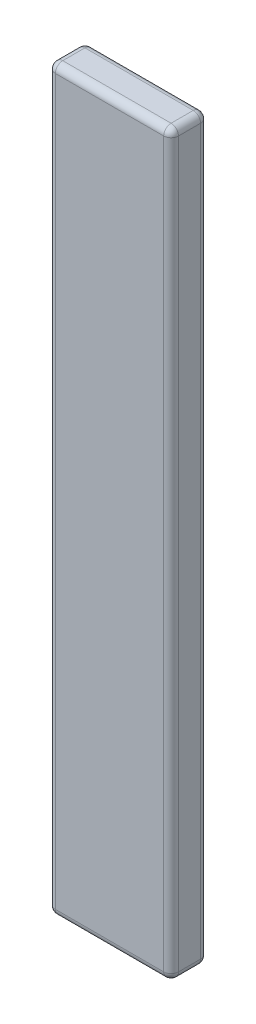
ISO-10303-21;
HEADER;
FILE_DESCRIPTION(('STEP AP214'),'2;1');
FILE_NAME('part.step','',(''),(''),'','','');
FILE_SCHEMA(('AUTOMOTIVE_DESIGN { 1 0 10303 214 1 1 1 1 }'));
ENDSEC;
DATA;
#1=APPLICATION_CONTEXT('core data for automotive mechanical design processes');
#2=APPLICATION_PROTOCOL_DEFINITION('international standard','automotive_design',2000,#1);
#3=PRODUCT_CONTEXT('',#1,'mechanical');
#4=PRODUCT('Part','Part','',(#3));
#5=PRODUCT_RELATED_PRODUCT_CATEGORY('part','',(#4));
#6=PRODUCT_DEFINITION_FORMATION('','',#4);
#7=PRODUCT_DEFINITION_CONTEXT('part definition',#1,'design');
#8=PRODUCT_DEFINITION('design','',#6,#7);
#9=PRODUCT_DEFINITION_SHAPE('','',#8);
#10=(LENGTH_UNIT() NAMED_UNIT(*) SI_UNIT(.MILLI.,.METRE.));
#11=(NAMED_UNIT(*) PLANE_ANGLE_UNIT() SI_UNIT($,.RADIAN.));
#12=(NAMED_UNIT(*) SI_UNIT($,.STERADIAN.) SOLID_ANGLE_UNIT());
#13=UNCERTAINTY_MEASURE_WITH_UNIT(LENGTH_MEASURE(1.E-05),#10,'distance_accuracy_value','');
#14=(GEOMETRIC_REPRESENTATION_CONTEXT(3) GLOBAL_UNCERTAINTY_ASSIGNED_CONTEXT((#13)) GLOBAL_UNIT_ASSIGNED_CONTEXT((#10,
#11,#12)) REPRESENTATION_CONTEXT('',''));
#15=CARTESIAN_POINT('',(0.,0.,0.));
#16=DIRECTION('',(0.,0.,1.));
#17=DIRECTION('',(1.,0.,0.));
#18=AXIS2_PLACEMENT_3D('',#15,#16,#17);
#19=CARTESIAN_POINT('',(0.,0.,3.));
#20=DIRECTION('',(1.,0.,0.));
#21=DIRECTION('',(0.,0.,-1.));
#22=AXIS2_PLACEMENT_3D('',#19,#20,#21);
#23=PLANE('',#22);
#24=DIRECTION('',(0.,-1.,0.));
#25=VECTOR('',#24,1.);
#26=CARTESIAN_POINT('',(0.,0.,0.6));
#27=LINE('',#26,#25);
#28=CARTESIAN_POINT('',(0.,-0.6,0.6));
#29=VERTEX_POINT('',#28);
#30=CARTESIAN_POINT('',(0.,-59.4,0.6));
#31=VERTEX_POINT('',#30);
#32=EDGE_CURVE('E174',#29,#31,#27,.T.);
#33=ORIENTED_EDGE('',*,*,#32,.T.);
#34=DIRECTION('',(0.,0.,-1.));
#35=VECTOR('',#34,1.);
#36=CARTESIAN_POINT('',(0.,-59.4,3.));
#37=LINE('',#36,#35);
#38=CARTESIAN_POINT('',(0.,-59.4,2.4));
#39=VERTEX_POINT('',#38);
#40=EDGE_CURVE('E176',#31,#39,#37,.F.);
#41=ORIENTED_EDGE('',*,*,#40,.T.);
#42=DIRECTION('',(0.,-1.,0.));
#43=VECTOR('',#42,1.);
#44=CARTESIAN_POINT('',(0.,0.,2.4));
#45=LINE('',#44,#43);
#46=CARTESIAN_POINT('',(0.,-0.6,2.4));
#47=VERTEX_POINT('',#46);
#48=EDGE_CURVE('E170',#39,#47,#45,.F.);
#49=ORIENTED_EDGE('',*,*,#48,.T.);
#50=DIRECTION('',(0.,0.,-1.));
#51=VECTOR('',#50,1.);
#52=CARTESIAN_POINT('',(0.,-0.6,3.));
#53=LINE('',#52,#51);
#54=EDGE_CURVE('E172',#47,#29,#53,.T.);
#55=ORIENTED_EDGE('',*,*,#54,.T.);
#56=EDGE_LOOP('',(#33,#41,#49,#55));
#57=FACE_BOUND('',#56,.T.);
#58=ADVANCED_FACE('F39',(#57),#23,.F.);
#59=CARTESIAN_POINT('',(0.,-60.,3.));
#60=DIRECTION('',(0.,1.,0.));
#61=DIRECTION('',(0.,0.,1.));
#62=AXIS2_PLACEMENT_3D('',#59,#60,#61);
#63=PLANE('',#62);
#64=DIRECTION('',(1.,0.,0.));
#65=VECTOR('',#64,1.);
#66=CARTESIAN_POINT('',(0.,-60.,2.4));
#67=LINE('',#66,#65);
#68=CARTESIAN_POINT('',(9.40000000000001,-60.,2.4));
#69=VERTEX_POINT('',#68);
#70=CARTESIAN_POINT('',(0.6,-60.,2.4));
#71=VERTEX_POINT('',#70);
#72=EDGE_CURVE('E132',#69,#71,#67,.F.);
#73=ORIENTED_EDGE('',*,*,#72,.T.);
#74=DIRECTION('',(0.,0.,-1.));
#75=VECTOR('',#74,1.);
#76=CARTESIAN_POINT('',(0.6,-60.,3.));
#77=LINE('',#76,#75);
#78=CARTESIAN_POINT('',(0.6,-60.,0.6));
#79=VERTEX_POINT('',#78);
#80=EDGE_CURVE('E168',#71,#79,#77,.T.);
#81=ORIENTED_EDGE('',*,*,#80,.T.);
#82=DIRECTION('',(1.,0.,0.));
#83=VECTOR('',#82,1.);
#84=CARTESIAN_POINT('',(0.,-60.,0.6));
#85=LINE('',#84,#83);
#86=CARTESIAN_POINT('',(9.40000000000001,-60.,0.6));
#87=VERTEX_POINT('',#86);
#88=EDGE_CURVE('E135',#79,#87,#85,.T.);
#89=ORIENTED_EDGE('',*,*,#88,.T.);
#90=DIRECTION('',(0.,0.,-1.));
#91=VECTOR('',#90,1.);
#92=CARTESIAN_POINT('',(9.40000000000001,-60.,3.));
#93=LINE('',#92,#91);
#94=EDGE_CURVE('E127',#87,#69,#93,.F.);
#95=ORIENTED_EDGE('',*,*,#94,.T.);
#96=EDGE_LOOP('',(#73,#81,#89,#95));
#97=FACE_BOUND('',#96,.T.);
#98=ADVANCED_FACE('F129',(#97),#63,.F.);
#99=CARTESIAN_POINT('',(10.,0.,3.));
#100=DIRECTION('',(-1.,0.,0.));
#101=DIRECTION('',(0.,-1.,0.));
#102=AXIS2_PLACEMENT_3D('',#99,#100,#101);
#103=PLANE('',#102);
#104=DIRECTION('',(0.,0.,-1.));
#105=VECTOR('',#104,1.);
#106=CARTESIAN_POINT('',(10.,-59.4,3.));
#107=LINE('',#106,#105);
#108=CARTESIAN_POINT('',(10.,-59.4,2.4));
#109=VERTEX_POINT('',#108);
#110=CARTESIAN_POINT('',(10.,-59.4,0.6));
#111=VERTEX_POINT('',#110);
#112=EDGE_CURVE('E145',#109,#111,#107,.T.);
#113=ORIENTED_EDGE('',*,*,#112,.T.);
#114=DIRECTION('',(0.,1.,0.));
#115=VECTOR('',#114,1.);
#116=CARTESIAN_POINT('',(10.,0.,0.6));
#117=LINE('',#116,#115);
#118=CARTESIAN_POINT('',(10.,-0.6,0.6));
#119=VERTEX_POINT('',#118);
#120=EDGE_CURVE('E193',#111,#119,#117,.T.);
#121=ORIENTED_EDGE('',*,*,#120,.T.);
#122=DIRECTION('',(0.,0.,-1.));
#123=VECTOR('',#122,1.);
#124=CARTESIAN_POINT('',(10.,-0.6,3.));
#125=LINE('',#124,#123);
#126=CARTESIAN_POINT('',(10.,-0.6,2.4));
#127=VERTEX_POINT('',#126);
#128=EDGE_CURVE('E190',#119,#127,#125,.F.);
#129=ORIENTED_EDGE('',*,*,#128,.T.);
#130=DIRECTION('',(0.,1.,0.));
#131=VECTOR('',#130,1.);
#132=CARTESIAN_POINT('',(10.,-60.,2.4));
#133=LINE('',#132,#131);
#134=EDGE_CURVE('E188',#127,#109,#133,.F.);
#135=ORIENTED_EDGE('',*,*,#134,.T.);
#136=EDGE_LOOP('',(#113,#121,#129,#135));
#137=FACE_BOUND('',#136,.T.);
#138=ADVANCED_FACE('F270',(#137),#103,.F.);
#139=CARTESIAN_POINT('',(0.,0.,3.));
#140=DIRECTION('',(0.,-1.,0.));
#141=DIRECTION('',(0.,0.,-1.));
#142=AXIS2_PLACEMENT_3D('',#139,#140,#141);
#143=PLANE('',#142);
#144=DIRECTION('',(-1.,0.,0.));
#145=VECTOR('',#144,1.);
#146=CARTESIAN_POINT('',(0.,0.,0.6));
#147=LINE('',#146,#145);
#148=CARTESIAN_POINT('',(9.4,0.,0.6));
#149=VERTEX_POINT('',#148);
#150=CARTESIAN_POINT('',(0.6,0.,0.6));
#151=VERTEX_POINT('',#150);
#152=EDGE_CURVE('E200',#149,#151,#147,.T.);
#153=ORIENTED_EDGE('',*,*,#152,.T.);
#154=DIRECTION('',(0.,0.,-1.));
#155=VECTOR('',#154,1.);
#156=CARTESIAN_POINT('',(0.6,0.,3.));
#157=LINE('',#156,#155);
#158=CARTESIAN_POINT('',(0.6,0.,2.4));
#159=VERTEX_POINT('',#158);
#160=EDGE_CURVE('E202',#151,#159,#157,.F.);
#161=ORIENTED_EDGE('',*,*,#160,.T.);
#162=DIRECTION('',(-1.,0.,0.));
#163=VECTOR('',#162,1.);
#164=CARTESIAN_POINT('',(10.,0.,2.4));
#165=LINE('',#164,#163);
#166=CARTESIAN_POINT('',(9.4,0.,2.4));
#167=VERTEX_POINT('',#166);
#168=EDGE_CURVE('E196',#159,#167,#165,.F.);
#169=ORIENTED_EDGE('',*,*,#168,.T.);
#170=DIRECTION('',(0.,0.,-1.));
#171=VECTOR('',#170,1.);
#172=CARTESIAN_POINT('',(9.4,0.,3.));
#173=LINE('',#172,#171);
#174=EDGE_CURVE('E198',#167,#149,#173,.T.);
#175=ORIENTED_EDGE('',*,*,#174,.T.);
#176=EDGE_LOOP('',(#153,#161,#169,#175));
#177=FACE_BOUND('',#176,.T.);
#178=ADVANCED_FACE('F299',(#177),#143,.F.);
#179=CARTESIAN_POINT('',(0.,0.,3.));
#180=DIRECTION('',(0.,0.,1.));
#181=DIRECTION('',(1.,0.,0.));
#182=AXIS2_PLACEMENT_3D('',#179,#180,#181);
#183=PLANE('',#182);
#184=DIRECTION('',(-1.,0.,0.));
#185=VECTOR('',#184,1.);
#186=CARTESIAN_POINT('',(0.,-0.6,3.));
#187=LINE('',#186,#185);
#188=CARTESIAN_POINT('',(9.4,-0.6,3.));
#189=VERTEX_POINT('',#188);
#190=CARTESIAN_POINT('',(0.6,-0.6,3.));
#191=VERTEX_POINT('',#190);
#192=EDGE_CURVE('E59',#189,#191,#187,.T.);
#193=ORIENTED_EDGE('',*,*,#192,.T.);
#194=DIRECTION('',(0.,-1.,0.));
#195=VECTOR('',#194,1.);
#196=CARTESIAN_POINT('',(0.6,-60.,3.));
#197=LINE('',#196,#195);
#198=CARTESIAN_POINT('',(0.6,-59.4,3.));
#199=VERTEX_POINT('',#198);
#200=EDGE_CURVE('E11',#191,#199,#197,.T.);
#201=ORIENTED_EDGE('',*,*,#200,.T.);
#202=DIRECTION('',(1.,0.,0.));
#203=VECTOR('',#202,1.);
#204=CARTESIAN_POINT('',(10.,-59.4,3.));
#205=LINE('',#204,#203);
#206=CARTESIAN_POINT('',(9.40000000000001,-59.4,3.));
#207=VERTEX_POINT('',#206);
#208=EDGE_CURVE('E48',#199,#207,#205,.T.);
#209=ORIENTED_EDGE('',*,*,#208,.T.);
#210=DIRECTION('',(0.,1.,0.));
#211=VECTOR('',#210,1.);
#212=CARTESIAN_POINT('',(9.4,0.,3.));
#213=LINE('',#212,#211);
#214=EDGE_CURVE('E205',#207,#189,#213,.T.);
#215=ORIENTED_EDGE('',*,*,#214,.T.);
#216=EDGE_LOOP('',(#193,#201,#209,#215));
#217=FACE_BOUND('',#216,.T.);
#218=ADVANCED_FACE('F315',(#217),#183,.T.);
#219=CARTESIAN_POINT('',(0.,0.,0.));
#220=DIRECTION('',(0.,0.,1.));
#221=DIRECTION('',(1.,0.,0.));
#222=AXIS2_PLACEMENT_3D('',#219,#220,#221);
#223=PLANE('',#222);
#224=DIRECTION('',(1.,0.,0.));
#225=VECTOR('',#224,1.);
#226=CARTESIAN_POINT('',(0.,-59.4,0.));
#227=LINE('',#226,#225);
#228=CARTESIAN_POINT('',(9.40000000000001,-59.4,0.));
#229=VERTEX_POINT('',#228);
#230=CARTESIAN_POINT('',(0.6,-59.4,0.));
#231=VERTEX_POINT('',#230);
#232=EDGE_CURVE('E183',#229,#231,#227,.F.);
#233=ORIENTED_EDGE('',*,*,#232,.T.);
#234=DIRECTION('',(0.,-1.,0.));
#235=VECTOR('',#234,1.);
#236=CARTESIAN_POINT('',(0.6,0.,0.));
#237=LINE('',#236,#235);
#238=CARTESIAN_POINT('',(0.6,-0.6,0.));
#239=VERTEX_POINT('',#238);
#240=EDGE_CURVE('E185',#231,#239,#237,.F.);
#241=ORIENTED_EDGE('',*,*,#240,.T.);
#242=DIRECTION('',(-1.,0.,0.));
#243=VECTOR('',#242,1.);
#244=CARTESIAN_POINT('',(0.,-0.6,0.));
#245=LINE('',#244,#243);
#246=CARTESIAN_POINT('',(9.4,-0.6,0.));
#247=VERTEX_POINT('',#246);
#248=EDGE_CURVE('E179',#239,#247,#245,.F.);
#249=ORIENTED_EDGE('',*,*,#248,.T.);
#250=DIRECTION('',(0.,1.,0.));
#251=VECTOR('',#250,1.);
#252=CARTESIAN_POINT('',(9.4,0.,0.));
#253=LINE('',#252,#251);
#254=EDGE_CURVE('E181',#247,#229,#253,.F.);
#255=ORIENTED_EDGE('',*,*,#254,.T.);
#256=EDGE_LOOP('',(#233,#241,#249,#255));
#257=FACE_BOUND('',#256,.T.);
#258=ADVANCED_FACE('F283',(#257),#223,.F.);
#259=CARTESIAN_POINT('',(9.4,-0.6,3.));
#260=DIRECTION('',(0.,0.,-1.));
#261=DIRECTION('',(-1.,0.,0.));
#262=AXIS2_PLACEMENT_3D('',#259,#260,#261);
#263=CYLINDRICAL_SURFACE('',#262,0.6);
#264=CARTESIAN_POINT('',(9.4,-0.6,2.4));
#265=DIRECTION('',(0.,0.,1.));
#266=DIRECTION('',(1.,0.,0.));
#267=AXIS2_PLACEMENT_3D('',#264,#265,#266);
#268=CIRCLE('',#267,0.6);
#269=EDGE_CURVE('E43',#127,#167,#268,.T.);
#270=ORIENTED_EDGE('',*,*,#269,.F.);
#271=ORIENTED_EDGE('',*,*,#128,.F.);
#272=CARTESIAN_POINT('',(9.4,-0.6,0.6));
#273=DIRECTION('',(0.,0.,-1.));
#274=DIRECTION('',(-1.,0.,0.));
#275=AXIS2_PLACEMENT_3D('',#272,#273,#274);
#276=CIRCLE('',#275,0.6);
#277=EDGE_CURVE('E165',#149,#119,#276,.T.);
#278=ORIENTED_EDGE('',*,*,#277,.F.);
#279=ORIENTED_EDGE('',*,*,#174,.F.);
#280=EDGE_LOOP('',(#270,#271,#278,#279));
#281=FACE_BOUND('',#280,.T.);
#282=ADVANCED_FACE('F41',(#281),#263,.T.);
#283=CARTESIAN_POINT('',(9.4,-0.6,2.4));
#284=DIRECTION('',(0.,1.,0.));
#285=DIRECTION('',(0.,0.,1.));
#286=AXIS2_PLACEMENT_3D('',#283,#284,#285);
#287=SPHERICAL_SURFACE('',#286,0.6);
#288=CARTESIAN_POINT('',(9.4,-0.6,2.4));
#289=DIRECTION('',(0.,1.,0.));
#290=DIRECTION('',(-1.,0.,0.));
#291=AXIS2_PLACEMENT_3D('',#288,#289,#290);
#292=CIRCLE('',#291,0.6);
#293=EDGE_CURVE('E250',#127,#189,#292,.F.);
#294=ORIENTED_EDGE('',*,*,#293,.F.);
#295=ORIENTED_EDGE('',*,*,#269,.T.);
#296=CARTESIAN_POINT('',(9.4,-0.6,2.4));
#297=DIRECTION('',(1.,0.,0.));
#298=DIRECTION('',(0.,0.,-1.));
#299=AXIS2_PLACEMENT_3D('',#296,#297,#298);
#300=CIRCLE('',#299,0.6);
#301=EDGE_CURVE('E253',#189,#167,#300,.F.);
#302=ORIENTED_EDGE('',*,*,#301,.F.);
#303=EDGE_LOOP('',(#294,#295,#302));
#304=FACE_BOUND('',#303,.T.);
#305=ADVANCED_FACE('F311',(#304),#287,.T.);
#306=CARTESIAN_POINT('',(9.4,-0.6,0.6));
#307=DIRECTION('',(1.,0.,0.));
#308=DIRECTION('',(0.,0.,-1.));
#309=AXIS2_PLACEMENT_3D('',#306,#307,#308);
#310=SPHERICAL_SURFACE('',#309,0.6);
#311=CARTESIAN_POINT('',(9.4,-0.6,0.6));
#312=DIRECTION('',(1.,0.,0.));
#313=DIRECTION('',(0.,0.,-1.));
#314=AXIS2_PLACEMENT_3D('',#311,#312,#313);
#315=CIRCLE('',#314,0.6);
#316=EDGE_CURVE('E245',#149,#247,#315,.F.);
#317=ORIENTED_EDGE('',*,*,#316,.F.);
#318=ORIENTED_EDGE('',*,*,#277,.T.);
#319=CARTESIAN_POINT('',(9.4,-0.6,0.6));
#320=DIRECTION('',(0.,1.,0.));
#321=DIRECTION('',(-1.,0.,0.));
#322=AXIS2_PLACEMENT_3D('',#319,#320,#321);
#323=CIRCLE('',#322,0.6);
#324=EDGE_CURVE('E248',#247,#119,#323,.F.);
#325=ORIENTED_EDGE('',*,*,#324,.F.);
#326=EDGE_LOOP('',(#317,#318,#325));
#327=FACE_BOUND('',#326,.T.);
#328=ADVANCED_FACE('F261',(#327),#310,.T.);
#329=CARTESIAN_POINT('',(0.,-0.6,2.4));
#330=DIRECTION('',(1.,0.,0.));
#331=DIRECTION('',(0.,0.,-1.));
#332=AXIS2_PLACEMENT_3D('',#329,#330,#331);
#333=CYLINDRICAL_SURFACE('',#332,0.6);
#334=ORIENTED_EDGE('',*,*,#301,.T.);
#335=ORIENTED_EDGE('',*,*,#168,.F.);
#336=CARTESIAN_POINT('',(0.6,-0.6,2.4));
#337=DIRECTION('',(-1.,0.,0.));
#338=DIRECTION('',(0.,0.,1.));
#339=AXIS2_PLACEMENT_3D('',#336,#337,#338);
#340=CIRCLE('',#339,0.6);
#341=EDGE_CURVE('E240',#191,#159,#340,.T.);
#342=ORIENTED_EDGE('',*,*,#341,.F.);
#343=ORIENTED_EDGE('',*,*,#192,.F.);
#344=EDGE_LOOP('',(#334,#335,#342,#343));
#345=FACE_BOUND('',#344,.T.);
#346=ADVANCED_FACE('F308',(#345),#333,.T.);
#347=CARTESIAN_POINT('',(9.4,0.,2.4));
#348=DIRECTION('',(0.,-1.,0.));
#349=DIRECTION('',(1.,0.,0.));
#350=AXIS2_PLACEMENT_3D('',#347,#348,#349);
#351=CYLINDRICAL_SURFACE('',#350,0.6);
#352=ORIENTED_EDGE('',*,*,#293,.T.);
#353=ORIENTED_EDGE('',*,*,#214,.F.);
#354=CARTESIAN_POINT('',(9.40000000000001,-59.4,2.4));
#355=DIRECTION('',(0.,-1.,0.));
#356=DIRECTION('',(0.,0.,-1.));
#357=AXIS2_PLACEMENT_3D('',#354,#355,#356);
#358=CIRCLE('',#357,0.6);
#359=EDGE_CURVE('E149',#109,#207,#358,.T.);
#360=ORIENTED_EDGE('',*,*,#359,.F.);
#361=ORIENTED_EDGE('',*,*,#134,.F.);
#362=EDGE_LOOP('',(#352,#353,#360,#361));
#363=FACE_BOUND('',#362,.T.);
#364=ADVANCED_FACE('F314',(#363),#351,.T.);
#365=CARTESIAN_POINT('',(9.40000000000001,-59.4,3.));
#366=DIRECTION('',(0.,0.,-1.));
#367=DIRECTION('',(-1.,0.,0.));
#368=AXIS2_PLACEMENT_3D('',#365,#366,#367);
#369=CYLINDRICAL_SURFACE('',#368,0.6);
#370=CARTESIAN_POINT('',(9.40000000000001,-59.4,0.6));
#371=DIRECTION('',(0.,0.,-1.));
#372=DIRECTION('',(-1.,0.,0.));
#373=AXIS2_PLACEMENT_3D('',#370,#371,#372);
#374=CIRCLE('',#373,0.6);
#375=EDGE_CURVE('E150',#111,#87,#374,.T.);
#376=ORIENTED_EDGE('',*,*,#375,.F.);
#377=ORIENTED_EDGE('',*,*,#112,.F.);
#378=CARTESIAN_POINT('',(9.40000000000001,-59.4,2.4));
#379=DIRECTION('',(0.,0.,1.));
#380=DIRECTION('',(1.,0.,0.));
#381=AXIS2_PLACEMENT_3D('',#378,#379,#380);
#382=CIRCLE('',#381,0.6);
#383=EDGE_CURVE('E142',#69,#109,#382,.T.);
#384=ORIENTED_EDGE('',*,*,#383,.F.);
#385=ORIENTED_EDGE('',*,*,#94,.F.);
#386=EDGE_LOOP('',(#376,#377,#384,#385));
#387=FACE_BOUND('',#386,.T.);
#388=ADVANCED_FACE('F144',(#387),#369,.T.);
#389=CARTESIAN_POINT('',(9.4,0.,0.6));
#390=DIRECTION('',(0.,1.,0.));
#391=DIRECTION('',(-1.,0.,0.));
#392=AXIS2_PLACEMENT_3D('',#389,#390,#391);
#393=CYLINDRICAL_SURFACE('',#392,0.6);
#394=ORIENTED_EDGE('',*,*,#324,.T.);
#395=ORIENTED_EDGE('',*,*,#120,.F.);
#396=CARTESIAN_POINT('',(9.40000000000001,-59.4,0.6));
#397=DIRECTION('',(0.,-1.,0.));
#398=DIRECTION('',(0.,0.,-1.));
#399=AXIS2_PLACEMENT_3D('',#396,#397,#398);
#400=CIRCLE('',#399,0.6);
#401=EDGE_CURVE('E235',#229,#111,#400,.T.);
#402=ORIENTED_EDGE('',*,*,#401,.F.);
#403=ORIENTED_EDGE('',*,*,#254,.F.);
#404=EDGE_LOOP('',(#394,#395,#402,#403));
#405=FACE_BOUND('',#404,.T.);
#406=ADVANCED_FACE('F273',(#405),#393,.T.);
#407=CARTESIAN_POINT('',(0.,-0.6,0.6));
#408=DIRECTION('',(-1.,0.,0.));
#409=DIRECTION('',(0.,0.,1.));
#410=AXIS2_PLACEMENT_3D('',#407,#408,#409);
#411=CYLINDRICAL_SURFACE('',#410,0.6);
#412=ORIENTED_EDGE('',*,*,#316,.T.);
#413=ORIENTED_EDGE('',*,*,#248,.F.);
#414=CARTESIAN_POINT('',(0.6,-0.6,0.6));
#415=DIRECTION('',(-1.,0.,0.));
#416=DIRECTION('',(0.,0.,1.));
#417=AXIS2_PLACEMENT_3D('',#414,#415,#416);
#418=CIRCLE('',#417,0.6);
#419=EDGE_CURVE('E232',#151,#239,#418,.T.);
#420=ORIENTED_EDGE('',*,*,#419,.F.);
#421=ORIENTED_EDGE('',*,*,#152,.F.);
#422=EDGE_LOOP('',(#412,#413,#420,#421));
#423=FACE_BOUND('',#422,.T.);
#424=ADVANCED_FACE('F296',(#423),#411,.T.);
#425=CARTESIAN_POINT('',(0.6,-0.6,3.));
#426=DIRECTION('',(0.,0.,-1.));
#427=DIRECTION('',(-1.,0.,0.));
#428=AXIS2_PLACEMENT_3D('',#425,#426,#427);
#429=CYLINDRICAL_SURFACE('',#428,0.6);
#430=CARTESIAN_POINT('',(0.6,-0.6,2.4));
#431=DIRECTION('',(0.,0.,1.));
#432=DIRECTION('',(1.,0.,0.));
#433=AXIS2_PLACEMENT_3D('',#430,#431,#432);
#434=CIRCLE('',#433,0.6);
#435=EDGE_CURVE('E242',#159,#47,#434,.T.);
#436=ORIENTED_EDGE('',*,*,#435,.F.);
#437=ORIENTED_EDGE('',*,*,#160,.F.);
#438=CARTESIAN_POINT('',(0.6,-0.6,0.6));
#439=DIRECTION('',(0.,0.,-1.));
#440=DIRECTION('',(-1.,0.,0.));
#441=AXIS2_PLACEMENT_3D('',#438,#439,#440);
#442=CIRCLE('',#441,0.6);
#443=EDGE_CURVE('E229',#29,#151,#442,.T.);
#444=ORIENTED_EDGE('',*,*,#443,.F.);
#445=ORIENTED_EDGE('',*,*,#54,.F.);
#446=EDGE_LOOP('',(#436,#437,#444,#445));
#447=FACE_BOUND('',#446,.T.);
#448=ADVANCED_FACE('F302',(#447),#429,.T.);
#449=CARTESIAN_POINT('',(0.6,-0.6,2.4));
#450=DIRECTION('',(0.,1.,0.));
#451=DIRECTION('',(0.,0.,1.));
#452=AXIS2_PLACEMENT_3D('',#449,#450,#451);
#453=SPHERICAL_SURFACE('',#452,0.6);
#454=ORIENTED_EDGE('',*,*,#341,.T.);
#455=ORIENTED_EDGE('',*,*,#435,.T.);
#456=CARTESIAN_POINT('',(0.6,-0.6,2.4));
#457=DIRECTION('',(0.,1.,0.));
#458=DIRECTION('',(0.,0.,1.));
#459=AXIS2_PLACEMENT_3D('',#456,#457,#458);
#460=CIRCLE('',#459,0.6);
#461=EDGE_CURVE('E156',#191,#47,#460,.F.);
#462=ORIENTED_EDGE('',*,*,#461,.F.);
#463=EDGE_LOOP('',(#454,#455,#462));
#464=FACE_BOUND('',#463,.T.);
#465=ADVANCED_FACE('F421',(#464),#453,.T.);
#466=CARTESIAN_POINT('',(9.40000000000001,-59.4,2.4));
#467=DIRECTION('',(1.,0.,0.));
#468=DIRECTION('',(0.,0.,-1.));
#469=AXIS2_PLACEMENT_3D('',#466,#467,#468);
#470=SPHERICAL_SURFACE('',#469,0.6);
#471=ORIENTED_EDGE('',*,*,#383,.T.);
#472=ORIENTED_EDGE('',*,*,#359,.T.);
#473=CARTESIAN_POINT('',(9.40000000000001,-59.4,2.4));
#474=DIRECTION('',(1.,0.,0.));
#475=DIRECTION('',(0.,0.,-1.));
#476=AXIS2_PLACEMENT_3D('',#473,#474,#475);
#477=CIRCLE('',#476,0.6);
#478=EDGE_CURVE('E152',#69,#207,#477,.F.);
#479=ORIENTED_EDGE('',*,*,#478,.F.);
#480=EDGE_LOOP('',(#471,#472,#479));
#481=FACE_BOUND('',#480,.T.);
#482=ADVANCED_FACE('F153',(#481),#470,.T.);
#483=CARTESIAN_POINT('',(9.40000000000001,-59.4,0.6));
#484=DIRECTION('',(1.,0.,0.));
#485=DIRECTION('',(0.,0.,-1.));
#486=AXIS2_PLACEMENT_3D('',#483,#484,#485);
#487=SPHERICAL_SURFACE('',#486,0.6);
#488=ORIENTED_EDGE('',*,*,#401,.T.);
#489=ORIENTED_EDGE('',*,*,#375,.T.);
#490=CARTESIAN_POINT('',(9.40000000000001,-59.4,0.6));
#491=DIRECTION('',(1.,0.,0.));
#492=DIRECTION('',(0.,0.,-1.));
#493=AXIS2_PLACEMENT_3D('',#490,#491,#492);
#494=CIRCLE('',#493,0.6);
#495=EDGE_CURVE('E157',#229,#87,#494,.F.);
#496=ORIENTED_EDGE('',*,*,#495,.F.);
#497=EDGE_LOOP('',(#488,#489,#496));
#498=FACE_BOUND('',#497,.T.);
#499=ADVANCED_FACE('F276',(#498),#487,.T.);
#500=CARTESIAN_POINT('',(0.6,-0.6,0.6));
#501=DIRECTION('',(0.,1.,0.));
#502=DIRECTION('',(0.,0.,1.));
#503=AXIS2_PLACEMENT_3D('',#500,#501,#502);
#504=SPHERICAL_SURFACE('',#503,0.6);
#505=ORIENTED_EDGE('',*,*,#443,.T.);
#506=ORIENTED_EDGE('',*,*,#419,.T.);
#507=CARTESIAN_POINT('',(0.6,-0.6,0.6));
#508=DIRECTION('',(0.,1.,0.));
#509=DIRECTION('',(0.,0.,1.));
#510=AXIS2_PLACEMENT_3D('',#507,#508,#509);
#511=CIRCLE('',#510,0.6);
#512=EDGE_CURVE('E223',#29,#239,#511,.F.);
#513=ORIENTED_EDGE('',*,*,#512,.F.);
#514=EDGE_LOOP('',(#505,#506,#513));
#515=FACE_BOUND('',#514,.T.);
#516=ADVANCED_FACE('F293',(#515),#504,.T.);
#517=CARTESIAN_POINT('',(0.6,0.,2.4));
#518=DIRECTION('',(0.,1.,0.));
#519=DIRECTION('',(0.,0.,1.));
#520=AXIS2_PLACEMENT_3D('',#517,#518,#519);
#521=CYLINDRICAL_SURFACE('',#520,0.6);
#522=ORIENTED_EDGE('',*,*,#461,.T.);
#523=ORIENTED_EDGE('',*,*,#48,.F.);
#524=CARTESIAN_POINT('',(0.6,-59.4,2.4));
#525=DIRECTION('',(0.,-1.,0.));
#526=DIRECTION('',(0.,0.,-1.));
#527=AXIS2_PLACEMENT_3D('',#524,#525,#526);
#528=CIRCLE('',#527,0.6);
#529=EDGE_CURVE('E220',#199,#39,#528,.T.);
#530=ORIENTED_EDGE('',*,*,#529,.F.);
#531=ORIENTED_EDGE('',*,*,#200,.F.);
#532=EDGE_LOOP('',(#522,#523,#530,#531));
#533=FACE_BOUND('',#532,.T.);
#534=ADVANCED_FACE('F319',(#533),#521,.T.);
#535=CARTESIAN_POINT('',(0.,-59.4,2.4));
#536=DIRECTION('',(-1.,0.,0.));
#537=DIRECTION('',(0.,0.,1.));
#538=AXIS2_PLACEMENT_3D('',#535,#536,#537);
#539=CYLINDRICAL_SURFACE('',#538,0.6);
#540=ORIENTED_EDGE('',*,*,#478,.T.);
#541=ORIENTED_EDGE('',*,*,#208,.F.);
#542=CARTESIAN_POINT('',(0.6,-59.4,2.4));
#543=DIRECTION('',(-1.,0.,0.));
#544=DIRECTION('',(0.,0.,1.));
#545=AXIS2_PLACEMENT_3D('',#542,#543,#544);
#546=CIRCLE('',#545,0.6);
#547=EDGE_CURVE('E161',#71,#199,#546,.T.);
#548=ORIENTED_EDGE('',*,*,#547,.F.);
#549=ORIENTED_EDGE('',*,*,#72,.F.);
#550=EDGE_LOOP('',(#540,#541,#548,#549));
#551=FACE_BOUND('',#550,.T.);
#552=ADVANCED_FACE('F159',(#551),#539,.T.);
#553=CARTESIAN_POINT('',(0.,-59.4,0.6));
#554=DIRECTION('',(1.,0.,0.));
#555=DIRECTION('',(0.,0.,-1.));
#556=AXIS2_PLACEMENT_3D('',#553,#554,#555);
#557=CYLINDRICAL_SURFACE('',#556,0.6);
#558=ORIENTED_EDGE('',*,*,#495,.T.);
#559=ORIENTED_EDGE('',*,*,#88,.F.);
#560=CARTESIAN_POINT('',(0.6,-59.4,0.6));
#561=DIRECTION('',(-1.,0.,0.));
#562=DIRECTION('',(0.,0.,1.));
#563=AXIS2_PLACEMENT_3D('',#560,#561,#562);
#564=CIRCLE('',#563,0.6);
#565=EDGE_CURVE('E216',#231,#79,#564,.T.);
#566=ORIENTED_EDGE('',*,*,#565,.F.);
#567=ORIENTED_EDGE('',*,*,#232,.F.);
#568=EDGE_LOOP('',(#558,#559,#566,#567));
#569=FACE_BOUND('',#568,.T.);
#570=ADVANCED_FACE('F280',(#569),#557,.T.);
#571=CARTESIAN_POINT('',(0.6,0.,0.6));
#572=DIRECTION('',(0.,-1.,0.));
#573=DIRECTION('',(0.,0.,-1.));
#574=AXIS2_PLACEMENT_3D('',#571,#572,#573);
#575=CYLINDRICAL_SURFACE('',#574,0.6);
#576=ORIENTED_EDGE('',*,*,#512,.T.);
#577=ORIENTED_EDGE('',*,*,#240,.F.);
#578=CARTESIAN_POINT('',(0.6,-59.4,0.6));
#579=DIRECTION('',(0.,-1.,0.));
#580=DIRECTION('',(0.,0.,-1.));
#581=AXIS2_PLACEMENT_3D('',#578,#579,#580);
#582=CIRCLE('',#581,0.6);
#583=EDGE_CURVE('E213',#31,#231,#582,.T.);
#584=ORIENTED_EDGE('',*,*,#583,.F.);
#585=ORIENTED_EDGE('',*,*,#32,.F.);
#586=EDGE_LOOP('',(#576,#577,#584,#585));
#587=FACE_BOUND('',#586,.T.);
#588=ADVANCED_FACE('F286',(#587),#575,.T.);
#589=CARTESIAN_POINT('',(0.6,-59.4,2.4));
#590=DIRECTION('',(0.,0.,1.));
#591=DIRECTION('',(1.,0.,0.));
#592=AXIS2_PLACEMENT_3D('',#589,#590,#591);
#593=SPHERICAL_SURFACE('',#592,0.6);
#594=ORIENTED_EDGE('',*,*,#547,.T.);
#595=ORIENTED_EDGE('',*,*,#529,.T.);
#596=CARTESIAN_POINT('',(0.6,-59.4,2.4));
#597=DIRECTION('',(0.,0.,1.));
#598=DIRECTION('',(1.,0.,0.));
#599=AXIS2_PLACEMENT_3D('',#596,#597,#598);
#600=CIRCLE('',#599,0.6);
#601=EDGE_CURVE('E211',#71,#39,#600,.F.);
#602=ORIENTED_EDGE('',*,*,#601,.F.);
#603=EDGE_LOOP('',(#594,#595,#602));
#604=FACE_BOUND('',#603,.T.);
#605=ADVANCED_FACE('F321',(#604),#593,.T.);
#606=CARTESIAN_POINT('',(0.6,-59.4,0.6));
#607=DIRECTION('',(0.,0.,-1.));
#608=DIRECTION('',(-1.,0.,0.));
#609=AXIS2_PLACEMENT_3D('',#606,#607,#608);
#610=SPHERICAL_SURFACE('',#609,0.6);
#611=ORIENTED_EDGE('',*,*,#583,.T.);
#612=ORIENTED_EDGE('',*,*,#565,.T.);
#613=CARTESIAN_POINT('',(0.6,-59.4,0.6));
#614=DIRECTION('',(0.,0.,-1.));
#615=DIRECTION('',(-1.,0.,0.));
#616=AXIS2_PLACEMENT_3D('',#613,#614,#615);
#617=CIRCLE('',#616,0.6);
#618=EDGE_CURVE('E209',#31,#79,#617,.F.);
#619=ORIENTED_EDGE('',*,*,#618,.F.);
#620=EDGE_LOOP('',(#611,#612,#619));
#621=FACE_BOUND('',#620,.T.);
#622=ADVANCED_FACE('F327',(#621),#610,.T.);
#623=CARTESIAN_POINT('',(0.6,-59.4,3.));
#624=DIRECTION('',(0.,0.,-1.));
#625=DIRECTION('',(-1.,0.,0.));
#626=AXIS2_PLACEMENT_3D('',#623,#624,#625);
#627=CYLINDRICAL_SURFACE('',#626,0.6);
#628=ORIENTED_EDGE('',*,*,#601,.T.);
#629=ORIENTED_EDGE('',*,*,#40,.F.);
#630=ORIENTED_EDGE('',*,*,#618,.T.);
#631=ORIENTED_EDGE('',*,*,#80,.F.);
#632=EDGE_LOOP('',(#628,#629,#630,#631));
#633=FACE_BOUND('',#632,.T.);
#634=ADVANCED_FACE('F324',(#633),#627,.T.);
#635=CLOSED_SHELL('',(#58,#98,#138,#178,#218,#258,#282,#305,#328,#346,#364,#388,#406,#424,#448,
#465,#482,#499,#516,#534,#552,#570,#588,#605,#622,#634));
#636=MANIFOLD_SOLID_BREP('B2',#635);
#637=ADVANCED_BREP_SHAPE_REPRESENTATION('',(#18,#636),#14);
#638=SHAPE_DEFINITION_REPRESENTATION(#9,#637);
ENDSEC;
END-ISO-10303-21;
